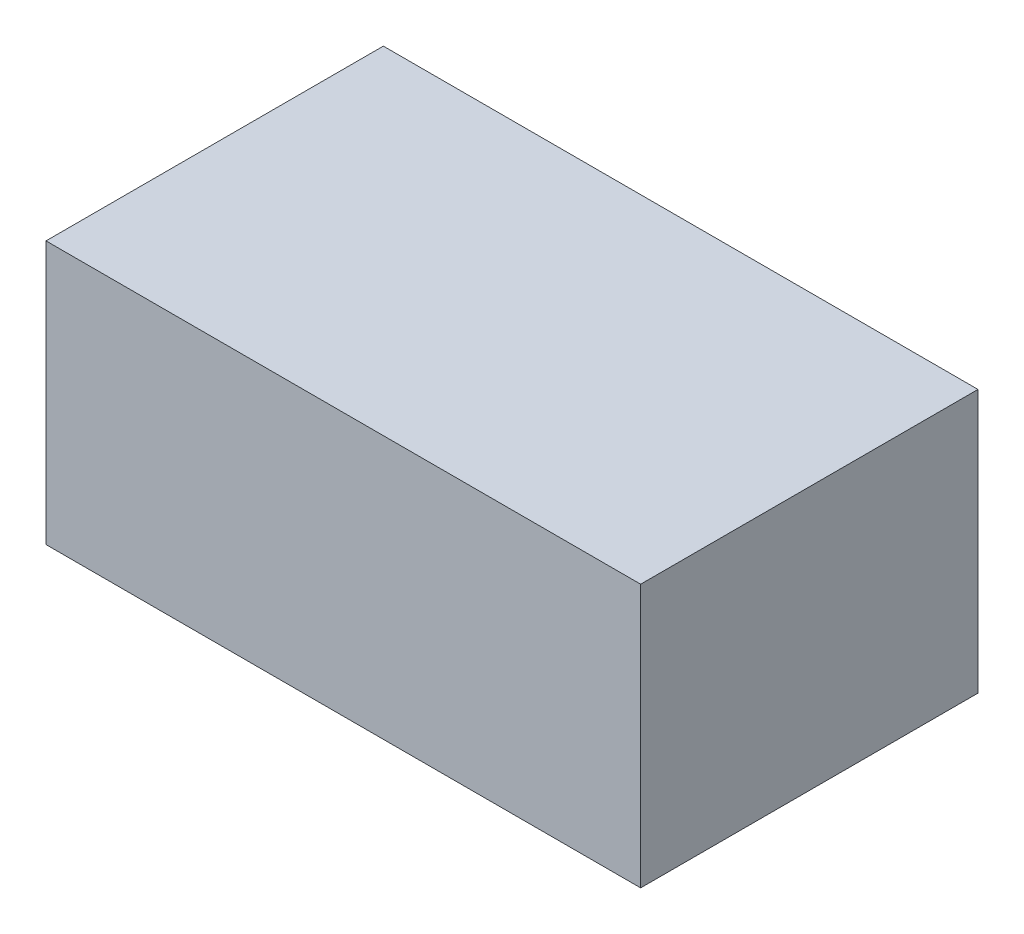
ISO-10303-21;
HEADER;
FILE_DESCRIPTION(('STEP AP214'),'2;1');
FILE_NAME('part.step','',(''),(''),'','','');
FILE_SCHEMA(('AUTOMOTIVE_DESIGN { 1 0 10303 214 1 1 1 1 }'));
ENDSEC;
DATA;
#1=APPLICATION_CONTEXT('core data for automotive mechanical design processes');
#2=APPLICATION_PROTOCOL_DEFINITION('international standard','automotive_design',2000,#1);
#3=PRODUCT_CONTEXT('',#1,'mechanical');
#4=PRODUCT('Part','Part','',(#3));
#5=PRODUCT_RELATED_PRODUCT_CATEGORY('part','',(#4));
#6=PRODUCT_DEFINITION_FORMATION('','',#4);
#7=PRODUCT_DEFINITION_CONTEXT('part definition',#1,'design');
#8=PRODUCT_DEFINITION('design','',#6,#7);
#9=PRODUCT_DEFINITION_SHAPE('','',#8);
#10=(LENGTH_UNIT() NAMED_UNIT(*) SI_UNIT(.MILLI.,.METRE.));
#11=(NAMED_UNIT(*) PLANE_ANGLE_UNIT() SI_UNIT($,.RADIAN.));
#12=(NAMED_UNIT(*) SI_UNIT($,.STERADIAN.) SOLID_ANGLE_UNIT());
#13=UNCERTAINTY_MEASURE_WITH_UNIT(LENGTH_MEASURE(1.E-05),#10,'distance_accuracy_value','');
#14=(GEOMETRIC_REPRESENTATION_CONTEXT(3) GLOBAL_UNCERTAINTY_ASSIGNED_CONTEXT((#13)) GLOBAL_UNIT_ASSIGNED_CONTEXT((#10,
#11,#12)) REPRESENTATION_CONTEXT('',''));
#15=CARTESIAN_POINT('',(0.,0.,0.));
#16=DIRECTION('',(0.,0.,1.));
#17=DIRECTION('',(1.,0.,0.));
#18=AXIS2_PLACEMENT_3D('',#15,#16,#17);
#19=CARTESIAN_POINT('',(0.,46.,0.));
#20=DIRECTION('',(1.,0.,0.));
#21=DIRECTION('',(0.,0.,-1.));
#22=AXIS2_PLACEMENT_3D('',#19,#20,#21);
#23=PLANE('',#22);
#24=DIRECTION('',(0.,0.,1.));
#25=VECTOR('',#24,1.);
#26=CARTESIAN_POINT('',(0.,0.,0.));
#27=LINE('',#26,#25);
#28=CARTESIAN_POINT('',(0.,0.,-59.));
#29=VERTEX_POINT('',#28);
#30=CARTESIAN_POINT('',(0.,0.,0.));
#31=VERTEX_POINT('',#30);
#32=EDGE_CURVE('E96',#29,#31,#27,.T.);
#33=ORIENTED_EDGE('',*,*,#32,.T.);
#34=DIRECTION('',(0.,-1.,0.));
#35=VECTOR('',#34,1.);
#36=CARTESIAN_POINT('',(0.,46.,0.));
#37=LINE('',#36,#35);
#38=CARTESIAN_POINT('',(0.,46.,0.));
#39=VERTEX_POINT('',#38);
#40=EDGE_CURVE('E11',#39,#31,#37,.T.);
#41=ORIENTED_EDGE('',*,*,#40,.F.);
#42=DIRECTION('',(0.,0.,1.));
#43=VECTOR('',#42,1.);
#44=CARTESIAN_POINT('',(0.,46.,0.));
#45=LINE('',#44,#43);
#46=CARTESIAN_POINT('',(0.,46.,-59.));
#47=VERTEX_POINT('',#46);
#48=EDGE_CURVE('E84',#47,#39,#45,.T.);
#49=ORIENTED_EDGE('',*,*,#48,.F.);
#50=DIRECTION('',(0.,-1.,0.));
#51=VECTOR('',#50,1.);
#52=CARTESIAN_POINT('',(0.,46.,-59.));
#53=LINE('',#52,#51);
#54=EDGE_CURVE('E92',#47,#29,#53,.T.);
#55=ORIENTED_EDGE('',*,*,#54,.T.);
#56=EDGE_LOOP('',(#33,#41,#49,#55));
#57=FACE_BOUND('',#56,.T.);
#58=ADVANCED_FACE('F33',(#57),#23,.F.);
#59=CARTESIAN_POINT('',(0.,46.,0.));
#60=DIRECTION('',(0.,0.,-1.));
#61=DIRECTION('',(-1.,0.,0.));
#62=AXIS2_PLACEMENT_3D('',#59,#60,#61);
#63=PLANE('',#62);
#64=DIRECTION('',(1.,0.,0.));
#65=VECTOR('',#64,1.);
#66=CARTESIAN_POINT('',(0.,0.,0.));
#67=LINE('',#66,#65);
#68=CARTESIAN_POINT('',(104.,0.,0.));
#69=VERTEX_POINT('',#68);
#70=EDGE_CURVE('E88',#31,#69,#67,.T.);
#71=ORIENTED_EDGE('',*,*,#70,.T.);
#72=DIRECTION('',(0.,-1.,0.));
#73=VECTOR('',#72,1.);
#74=CARTESIAN_POINT('',(104.,46.,0.));
#75=LINE('',#74,#73);
#76=CARTESIAN_POINT('',(104.,46.,0.));
#77=VERTEX_POINT('',#76);
#78=EDGE_CURVE('E41',#77,#69,#75,.T.);
#79=ORIENTED_EDGE('',*,*,#78,.F.);
#80=DIRECTION('',(1.,0.,0.));
#81=VECTOR('',#80,1.);
#82=CARTESIAN_POINT('',(0.,46.,0.));
#83=LINE('',#82,#81);
#84=EDGE_CURVE('E79',#39,#77,#83,.T.);
#85=ORIENTED_EDGE('',*,*,#84,.F.);
#86=ORIENTED_EDGE('',*,*,#40,.T.);
#87=EDGE_LOOP('',(#71,#79,#85,#86));
#88=FACE_BOUND('',#87,.T.);
#89=ADVANCED_FACE('F87',(#88),#63,.F.);
#90=CARTESIAN_POINT('',(104.,46.,0.));
#91=DIRECTION('',(-1.,0.,0.));
#92=DIRECTION('',(0.,0.,1.));
#93=AXIS2_PLACEMENT_3D('',#90,#91,#92);
#94=PLANE('',#93);
#95=DIRECTION('',(0.,0.,-1.));
#96=VECTOR('',#95,1.);
#97=CARTESIAN_POINT('',(104.,0.,0.));
#98=LINE('',#97,#96);
#99=CARTESIAN_POINT('',(104.,0.,-59.));
#100=VERTEX_POINT('',#99);
#101=EDGE_CURVE('E66',#69,#100,#98,.T.);
#102=ORIENTED_EDGE('',*,*,#101,.T.);
#103=DIRECTION('',(0.,-1.,0.));
#104=VECTOR('',#103,1.);
#105=CARTESIAN_POINT('',(104.,46.,-59.));
#106=LINE('',#105,#104);
#107=CARTESIAN_POINT('',(104.,46.,-59.));
#108=VERTEX_POINT('',#107);
#109=EDGE_CURVE('E89',#108,#100,#106,.T.);
#110=ORIENTED_EDGE('',*,*,#109,.F.);
#111=DIRECTION('',(0.,0.,-1.));
#112=VECTOR('',#111,1.);
#113=CARTESIAN_POINT('',(104.,46.,0.));
#114=LINE('',#113,#112);
#115=EDGE_CURVE('E82',#77,#108,#114,.T.);
#116=ORIENTED_EDGE('',*,*,#115,.F.);
#117=ORIENTED_EDGE('',*,*,#78,.T.);
#118=EDGE_LOOP('',(#102,#110,#116,#117));
#119=FACE_BOUND('',#118,.T.);
#120=ADVANCED_FACE('F90',(#119),#94,.F.);
#121=CARTESIAN_POINT('',(0.,46.,-59.));
#122=DIRECTION('',(0.,0.,1.));
#123=DIRECTION('',(1.,0.,0.));
#124=AXIS2_PLACEMENT_3D('',#121,#122,#123);
#125=PLANE('',#124);
#126=DIRECTION('',(-1.,0.,0.));
#127=VECTOR('',#126,1.);
#128=CARTESIAN_POINT('',(0.,0.,-59.));
#129=LINE('',#128,#127);
#130=EDGE_CURVE('E72',#100,#29,#129,.T.);
#131=ORIENTED_EDGE('',*,*,#130,.T.);
#132=ORIENTED_EDGE('',*,*,#54,.F.);
#133=DIRECTION('',(-1.,0.,0.));
#134=VECTOR('',#133,1.);
#135=CARTESIAN_POINT('',(0.,46.,-59.));
#136=LINE('',#135,#134);
#137=EDGE_CURVE('E49',#108,#47,#136,.T.);
#138=ORIENTED_EDGE('',*,*,#137,.F.);
#139=ORIENTED_EDGE('',*,*,#109,.T.);
#140=EDGE_LOOP('',(#131,#132,#138,#139));
#141=FACE_BOUND('',#140,.T.);
#142=ADVANCED_FACE('F103',(#141),#125,.F.);
#143=CARTESIAN_POINT('',(0.,46.,0.));
#144=DIRECTION('',(0.,-1.,0.));
#145=DIRECTION('',(0.,0.,-1.));
#146=AXIS2_PLACEMENT_3D('',#143,#144,#145);
#147=PLANE('',#146);
#148=ORIENTED_EDGE('',*,*,#48,.T.);
#149=ORIENTED_EDGE('',*,*,#84,.T.);
#150=ORIENTED_EDGE('',*,*,#115,.T.);
#151=ORIENTED_EDGE('',*,*,#137,.T.);
#152=EDGE_LOOP('',(#148,#149,#150,#151));
#153=FACE_BOUND('',#152,.T.);
#154=ADVANCED_FACE('F80',(#153),#147,.F.);
#155=CARTESIAN_POINT('',(0.,0.,0.));
#156=DIRECTION('',(0.,-1.,0.));
#157=DIRECTION('',(0.,0.,-1.));
#158=AXIS2_PLACEMENT_3D('',#155,#156,#157);
#159=PLANE('',#158);
#160=ORIENTED_EDGE('',*,*,#32,.F.);
#161=ORIENTED_EDGE('',*,*,#130,.F.);
#162=ORIENTED_EDGE('',*,*,#101,.F.);
#163=ORIENTED_EDGE('',*,*,#70,.F.);
#164=EDGE_LOOP('',(#160,#161,#162,#163));
#165=FACE_BOUND('',#164,.T.);
#166=ADVANCED_FACE('F106',(#165),#159,.T.);
#167=CLOSED_SHELL('',(#58,#89,#120,#142,#154,#166));
#168=MANIFOLD_SOLID_BREP('B2',#167);
#169=ADVANCED_BREP_SHAPE_REPRESENTATION('',(#18,#168),#14);
#170=SHAPE_DEFINITION_REPRESENTATION(#9,#169);
ENDSEC;
END-ISO-10303-21;
